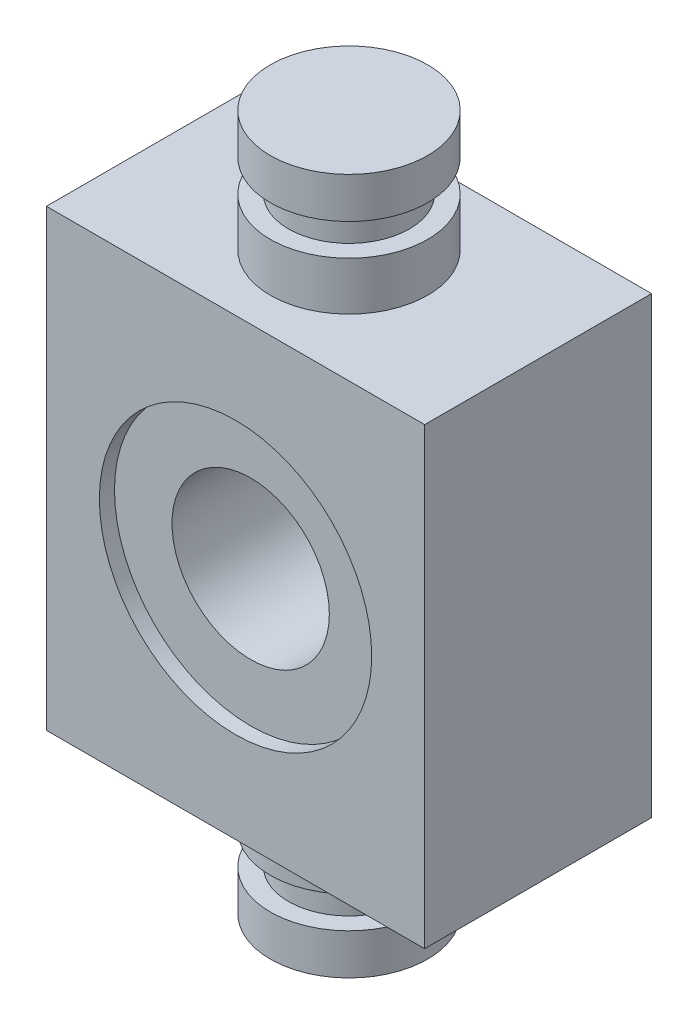
ISO-10303-21;
HEADER;
FILE_DESCRIPTION(('STEP AP214'),'2;1');
FILE_NAME('part.step','',(''),(''),'','','');
FILE_SCHEMA(('AUTOMOTIVE_DESIGN { 1 0 10303 214 1 1 1 1 }'));
ENDSEC;
DATA;
#1=APPLICATION_CONTEXT('core data for automotive mechanical design processes');
#2=APPLICATION_PROTOCOL_DEFINITION('international standard','automotive_design',2000,#1);
#3=PRODUCT_CONTEXT('',#1,'mechanical');
#4=PRODUCT('Part','Part','',(#3));
#5=PRODUCT_RELATED_PRODUCT_CATEGORY('part','',(#4));
#6=PRODUCT_DEFINITION_FORMATION('','',#4);
#7=PRODUCT_DEFINITION_CONTEXT('part definition',#1,'design');
#8=PRODUCT_DEFINITION('design','',#6,#7);
#9=PRODUCT_DEFINITION_SHAPE('','',#8);
#10=(LENGTH_UNIT() NAMED_UNIT(*) SI_UNIT(.MILLI.,.METRE.));
#11=(NAMED_UNIT(*) PLANE_ANGLE_UNIT() SI_UNIT($,.RADIAN.));
#12=(NAMED_UNIT(*) SI_UNIT($,.STERADIAN.) SOLID_ANGLE_UNIT());
#13=UNCERTAINTY_MEASURE_WITH_UNIT(LENGTH_MEASURE(1.E-05),#10,'distance_accuracy_value','');
#14=(GEOMETRIC_REPRESENTATION_CONTEXT(3) GLOBAL_UNCERTAINTY_ASSIGNED_CONTEXT((#13)) GLOBAL_UNIT_ASSIGNED_CONTEXT((#10,
#11,#12)) REPRESENTATION_CONTEXT('',''));
#15=CARTESIAN_POINT('',(0.,0.,0.));
#16=DIRECTION('',(0.,0.,1.));
#17=DIRECTION('',(1.,0.,0.));
#18=AXIS2_PLACEMENT_3D('',#15,#16,#17);
#19=CARTESIAN_POINT('',(-62.5,-75.,37.5));
#20=DIRECTION('',(0.,1.,0.));
#21=DIRECTION('',(-1.,0.,0.));
#22=AXIS2_PLACEMENT_3D('',#19,#20,#21);
#23=PLANE('',#22);
#24=CARTESIAN_POINT('',(0.,-75.,0.));
#25=DIRECTION('',(0.,1.,0.));
#26=DIRECTION('',(-1.,0.,0.));
#27=AXIS2_PLACEMENT_3D('',#24,#25,#26);
#28=CIRCLE('',#27,26.);
#29=CARTESIAN_POINT('',(-26.,-75.,0.));
#30=VERTEX_POINT('',#29);
#31=EDGE_CURVE('E163',#30,#30,#28,.T.);
#32=ORIENTED_EDGE('',*,*,#31,.T.);
#33=EDGE_LOOP('',(#32));
#34=FACE_BOUND('',#33,.T.);
#35=DIRECTION('',(1.,0.,0.));
#36=VECTOR('',#35,1.);
#37=CARTESIAN_POINT('',(-62.5,-75.,-37.5));
#38=LINE('',#37,#36);
#39=CARTESIAN_POINT('',(-62.5,-75.,-37.5));
#40=VERTEX_POINT('',#39);
#41=CARTESIAN_POINT('',(62.5,-75.,-37.5));
#42=VERTEX_POINT('',#41);
#43=EDGE_CURVE('E108',#40,#42,#38,.T.);
#44=ORIENTED_EDGE('',*,*,#43,.T.);
#45=DIRECTION('',(0.,0.,-1.));
#46=VECTOR('',#45,1.);
#47=CARTESIAN_POINT('',(62.5,-75.,37.5));
#48=LINE('',#47,#46);
#49=CARTESIAN_POINT('',(62.5,-75.,37.5));
#50=VERTEX_POINT('',#49);
#51=EDGE_CURVE('E99',#50,#42,#48,.T.);
#52=ORIENTED_EDGE('',*,*,#51,.F.);
#53=DIRECTION('',(1.,0.,0.));
#54=VECTOR('',#53,1.);
#55=CARTESIAN_POINT('',(-62.5,-75.,37.5));
#56=LINE('',#55,#54);
#57=CARTESIAN_POINT('',(-62.5,-75.,37.5));
#58=VERTEX_POINT('',#57);
#59=EDGE_CURVE('E93',#58,#50,#56,.T.);
#60=ORIENTED_EDGE('',*,*,#59,.F.);
#61=DIRECTION('',(0.,0.,-1.));
#62=VECTOR('',#61,1.);
#63=CARTESIAN_POINT('',(-62.5,-75.,37.5));
#64=LINE('',#63,#62);
#65=EDGE_CURVE('E104',#58,#40,#64,.T.);
#66=ORIENTED_EDGE('',*,*,#65,.T.);
#67=EDGE_LOOP('',(#44,#52,#60,#66));
#68=FACE_BOUND('',#67,.T.);
#69=ADVANCED_FACE('F39',(#34,#68),#23,.F.);
#70=CARTESIAN_POINT('',(62.5,-75.,37.5));
#71=DIRECTION('',(-1.,0.,0.));
#72=DIRECTION('',(0.,-1.,0.));
#73=AXIS2_PLACEMENT_3D('',#70,#71,#72);
#74=PLANE('',#73);
#75=DIRECTION('',(0.,1.,0.));
#76=VECTOR('',#75,1.);
#77=CARTESIAN_POINT('',(62.5,-75.,-37.5));
#78=LINE('',#77,#76);
#79=CARTESIAN_POINT('',(62.5,75.,-37.5));
#80=VERTEX_POINT('',#79);
#81=EDGE_CURVE('E98',#42,#80,#78,.T.);
#82=ORIENTED_EDGE('',*,*,#81,.T.);
#83=DIRECTION('',(0.,0.,-1.));
#84=VECTOR('',#83,1.);
#85=CARTESIAN_POINT('',(62.5,75.,37.5));
#86=LINE('',#85,#84);
#87=CARTESIAN_POINT('',(62.5,75.,37.5));
#88=VERTEX_POINT('',#87);
#89=EDGE_CURVE('E96',#88,#80,#86,.T.);
#90=ORIENTED_EDGE('',*,*,#89,.F.);
#91=DIRECTION('',(0.,1.,0.));
#92=VECTOR('',#91,1.);
#93=CARTESIAN_POINT('',(62.5,-75.,37.5));
#94=LINE('',#93,#92);
#95=EDGE_CURVE('E88',#50,#88,#94,.T.);
#96=ORIENTED_EDGE('',*,*,#95,.F.);
#97=ORIENTED_EDGE('',*,*,#51,.T.);
#98=EDGE_LOOP('',(#82,#90,#96,#97));
#99=FACE_BOUND('',#98,.T.);
#100=ADVANCED_FACE('F97',(#99),#74,.F.);
#101=CARTESIAN_POINT('',(-62.5,75.,37.5));
#102=DIRECTION('',(0.,-1.,0.));
#103=DIRECTION('',(1.,0.,0.));
#104=AXIS2_PLACEMENT_3D('',#101,#102,#103);
#105=PLANE('',#104);
#106=CARTESIAN_POINT('',(0.,75.,0.));
#107=DIRECTION('',(0.,1.,0.));
#108=DIRECTION('',(-1.,0.,0.));
#109=AXIS2_PLACEMENT_3D('',#106,#107,#108);
#110=CIRCLE('',#109,26.);
#111=CARTESIAN_POINT('',(-26.,75.,0.));
#112=VERTEX_POINT('',#111);
#113=EDGE_CURVE('E48',#112,#112,#110,.T.);
#114=ORIENTED_EDGE('',*,*,#113,.F.);
#115=EDGE_LOOP('',(#114));
#116=FACE_BOUND('',#115,.T.);
#117=DIRECTION('',(-1.,0.,0.));
#118=VECTOR('',#117,1.);
#119=CARTESIAN_POINT('',(-62.5,75.,-37.5));
#120=LINE('',#119,#118);
#121=CARTESIAN_POINT('',(-62.5,75.,-37.5));
#122=VERTEX_POINT('',#121);
#123=EDGE_CURVE('E74',#80,#122,#120,.T.);
#124=ORIENTED_EDGE('',*,*,#123,.T.);
#125=DIRECTION('',(0.,0.,-1.));
#126=VECTOR('',#125,1.);
#127=CARTESIAN_POINT('',(-62.5,75.,37.5));
#128=LINE('',#127,#126);
#129=CARTESIAN_POINT('',(-62.5,75.,37.5));
#130=VERTEX_POINT('',#129);
#131=EDGE_CURVE('E100',#130,#122,#128,.T.);
#132=ORIENTED_EDGE('',*,*,#131,.F.);
#133=DIRECTION('',(-1.,0.,0.));
#134=VECTOR('',#133,1.);
#135=CARTESIAN_POINT('',(-62.5,75.,37.5));
#136=LINE('',#135,#134);
#137=EDGE_CURVE('E91',#88,#130,#136,.T.);
#138=ORIENTED_EDGE('',*,*,#137,.F.);
#139=ORIENTED_EDGE('',*,*,#89,.T.);
#140=EDGE_LOOP('',(#124,#132,#138,#139));
#141=FACE_BOUND('',#140,.T.);
#142=ADVANCED_FACE('F102',(#116,#141),#105,.F.);
#143=CARTESIAN_POINT('',(-62.5,-75.,37.5));
#144=DIRECTION('',(1.,0.,0.));
#145=DIRECTION('',(0.,1.,0.));
#146=AXIS2_PLACEMENT_3D('',#143,#144,#145);
#147=PLANE('',#146);
#148=DIRECTION('',(0.,-1.,0.));
#149=VECTOR('',#148,1.);
#150=CARTESIAN_POINT('',(-62.5,-75.,-37.5));
#151=LINE('',#150,#149);
#152=EDGE_CURVE('E80',#122,#40,#151,.T.);
#153=ORIENTED_EDGE('',*,*,#152,.T.);
#154=ORIENTED_EDGE('',*,*,#65,.F.);
#155=DIRECTION('',(0.,-1.,0.));
#156=VECTOR('',#155,1.);
#157=CARTESIAN_POINT('',(-62.5,-75.,37.5));
#158=LINE('',#157,#156);
#159=EDGE_CURVE('E57',#130,#58,#158,.T.);
#160=ORIENTED_EDGE('',*,*,#159,.F.);
#161=ORIENTED_EDGE('',*,*,#131,.T.);
#162=EDGE_LOOP('',(#153,#154,#160,#161));
#163=FACE_BOUND('',#162,.T.);
#164=ADVANCED_FACE('F166',(#163),#147,.F.);
#165=CARTESIAN_POINT('',(0.,0.,37.5));
#166=DIRECTION('',(0.,0.,1.));
#167=DIRECTION('',(1.,0.,0.));
#168=AXIS2_PLACEMENT_3D('',#165,#166,#167);
#169=PLANE('',#168);
#170=CARTESIAN_POINT('',(0.,0.,37.5));
#171=DIRECTION('',(0.,0.,1.));
#172=DIRECTION('',(1.,0.,0.));
#173=AXIS2_PLACEMENT_3D('',#170,#171,#172);
#174=CIRCLE('',#173,45.);
#175=CARTESIAN_POINT('',(-45.,0.,37.5));
#176=VERTEX_POINT('',#175);
#177=EDGE_CURVE('E42',#176,#176,#174,.F.);
#178=ORIENTED_EDGE('',*,*,#177,.T.);
#179=EDGE_LOOP('',(#178));
#180=FACE_BOUND('',#179,.T.);
#181=ORIENTED_EDGE('',*,*,#59,.T.);
#182=ORIENTED_EDGE('',*,*,#95,.T.);
#183=ORIENTED_EDGE('',*,*,#137,.T.);
#184=ORIENTED_EDGE('',*,*,#159,.T.);
#185=EDGE_LOOP('',(#181,#182,#183,#184));
#186=FACE_BOUND('',#185,.T.);
#187=ADVANCED_FACE('F89',(#180,#186),#169,.T.);
#188=CARTESIAN_POINT('',(0.,0.,-37.5));
#189=DIRECTION('',(0.,0.,1.));
#190=DIRECTION('',(1.,0.,0.));
#191=AXIS2_PLACEMENT_3D('',#188,#189,#190);
#192=PLANE('',#191);
#193=CARTESIAN_POINT('',(0.,0.,-37.5));
#194=DIRECTION('',(0.,0.,1.));
#195=DIRECTION('',(1.,0.,0.));
#196=AXIS2_PLACEMENT_3D('',#193,#194,#195);
#197=CIRCLE('',#196,26.);
#198=CARTESIAN_POINT('',(26.,0.,-37.5));
#199=VERTEX_POINT('',#198);
#200=EDGE_CURVE('E125',#199,#199,#197,.F.);
#201=ORIENTED_EDGE('',*,*,#200,.F.);
#202=EDGE_LOOP('',(#201));
#203=FACE_BOUND('',#202,.T.);
#204=ORIENTED_EDGE('',*,*,#43,.F.);
#205=ORIENTED_EDGE('',*,*,#152,.F.);
#206=ORIENTED_EDGE('',*,*,#123,.F.);
#207=ORIENTED_EDGE('',*,*,#81,.F.);
#208=EDGE_LOOP('',(#204,#205,#206,#207));
#209=FACE_BOUND('',#208,.T.);
#210=ADVANCED_FACE('F140',(#203,#209),#192,.F.);
#211=CARTESIAN_POINT('',(0.,0.,37.500012));
#212=DIRECTION('',(0.,0.,-1.));
#213=DIRECTION('',(-1.,0.,0.));
#214=AXIS2_PLACEMENT_3D('',#211,#212,#213);
#215=CYLINDRICAL_SURFACE('',#214,45.);
#216=CARTESIAN_POINT('',(0.,0.,32.5));
#217=DIRECTION('',(0.,0.,1.));
#218=DIRECTION('',(1.,0.,0.));
#219=AXIS2_PLACEMENT_3D('',#216,#217,#218);
#220=CIRCLE('',#219,45.);
#221=CARTESIAN_POINT('',(-45.,0.,32.5));
#222=VERTEX_POINT('',#221);
#223=EDGE_CURVE('E128',#222,#222,#220,.T.);
#224=CARTESIAN_POINT('',(-45.,0.,37.5));
#225=CARTESIAN_POINT('',(-45.,0.,37.4479166666667));
#226=CARTESIAN_POINT('',(-45.,0.,37.3958333333333));
#227=CARTESIAN_POINT('',(-45.,0.,37.2916666666667));
#228=CARTESIAN_POINT('',(-45.,0.,37.2395833333333));
#229=CARTESIAN_POINT('',(-45.,0.,37.1354166666667));
#230=CARTESIAN_POINT('',(-45.,0.,37.0833333333333));
#231=CARTESIAN_POINT('',(-45.,0.,36.9791666666667));
#232=CARTESIAN_POINT('',(-45.,0.,36.9270833333333));
#233=CARTESIAN_POINT('',(-45.,0.,36.8229166666667));
#234=CARTESIAN_POINT('',(-45.,0.,36.7708333333333));
#235=CARTESIAN_POINT('',(-45.,0.,36.6666666666667));
#236=CARTESIAN_POINT('',(-45.,0.,36.6145833333333));
#237=CARTESIAN_POINT('',(-45.,0.,36.5104166666667));
#238=CARTESIAN_POINT('',(-45.,0.,36.4583333333333));
#239=CARTESIAN_POINT('',(-45.,0.,36.3541666666667));
#240=CARTESIAN_POINT('',(-45.,0.,36.3020833333333));
#241=CARTESIAN_POINT('',(-45.,0.,36.1979166666667));
#242=CARTESIAN_POINT('',(-45.,0.,36.1458333333333));
#243=CARTESIAN_POINT('',(-45.,0.,36.0416666666667));
#244=CARTESIAN_POINT('',(-45.,0.,35.9895833333333));
#245=CARTESIAN_POINT('',(-45.,0.,35.8854166666667));
#246=CARTESIAN_POINT('',(-45.,0.,35.8333333333333));
#247=CARTESIAN_POINT('',(-45.,0.,35.7291666666667));
#248=CARTESIAN_POINT('',(-45.,0.,35.6770833333333));
#249=CARTESIAN_POINT('',(-45.,0.,35.5729166666667));
#250=CARTESIAN_POINT('',(-45.,0.,35.5208333333333));
#251=CARTESIAN_POINT('',(-45.,0.,35.4166666666667));
#252=CARTESIAN_POINT('',(-45.,0.,35.3645833333333));
#253=CARTESIAN_POINT('',(-45.,0.,35.2604166666667));
#254=CARTESIAN_POINT('',(-45.,0.,35.2083333333333));
#255=CARTESIAN_POINT('',(-45.,0.,35.1041666666667));
#256=CARTESIAN_POINT('',(-45.,0.,35.0520833333333));
#257=CARTESIAN_POINT('',(-45.,0.,34.9479166666667));
#258=CARTESIAN_POINT('',(-45.,0.,34.8958333333333));
#259=CARTESIAN_POINT('',(-45.,0.,34.7916666666667));
#260=CARTESIAN_POINT('',(-45.,0.,34.7395833333333));
#261=CARTESIAN_POINT('',(-45.,0.,34.6354166666667));
#262=CARTESIAN_POINT('',(-45.,0.,34.5833333333333));
#263=CARTESIAN_POINT('',(-45.,0.,34.4791666666667));
#264=CARTESIAN_POINT('',(-45.,0.,34.4270833333333));
#265=CARTESIAN_POINT('',(-45.,0.,34.3229166666667));
#266=CARTESIAN_POINT('',(-45.,0.,34.2708333333333));
#267=CARTESIAN_POINT('',(-45.,0.,34.1666666666667));
#268=CARTESIAN_POINT('',(-45.,0.,34.1145833333333));
#269=CARTESIAN_POINT('',(-45.,0.,34.0104166666667));
#270=CARTESIAN_POINT('',(-45.,0.,33.9583333333333));
#271=CARTESIAN_POINT('',(-45.,0.,33.8541666666667));
#272=CARTESIAN_POINT('',(-45.,0.,33.8020833333333));
#273=CARTESIAN_POINT('',(-45.,0.,33.6979166666667));
#274=CARTESIAN_POINT('',(-45.,0.,33.6458333333333));
#275=CARTESIAN_POINT('',(-45.,0.,33.5416666666667));
#276=CARTESIAN_POINT('',(-45.,0.,33.4895833333333));
#277=CARTESIAN_POINT('',(-45.,0.,33.3854166666667));
#278=CARTESIAN_POINT('',(-45.,0.,33.3333333333333));
#279=CARTESIAN_POINT('',(-45.,0.,33.2291666666667));
#280=CARTESIAN_POINT('',(-45.,0.,33.1770833333333));
#281=CARTESIAN_POINT('',(-45.,0.,33.0729166666667));
#282=CARTESIAN_POINT('',(-45.,0.,33.0208333333333));
#283=CARTESIAN_POINT('',(-45.,0.,32.9166666666667));
#284=CARTESIAN_POINT('',(-45.,0.,32.8645833333333));
#285=CARTESIAN_POINT('',(-45.,0.,32.7604166666667));
#286=CARTESIAN_POINT('',(-45.,0.,32.7083333333333));
#287=CARTESIAN_POINT('',(-45.,0.,32.6041666666667));
#288=CARTESIAN_POINT('',(-45.,0.,32.5520833333333));
#289=CARTESIAN_POINT('',(-45.,0.,32.5));
#290=B_SPLINE_CURVE_WITH_KNOTS('',3,(#224,#225,#226,#227,#228,#229,#230,#231,#232,#233,#234,
#235,#236,#237,#238,#239,#240,#241,#242,#243,#244,#245,#246,#247,#248,#249,#250,#251,#252,#253,
#254,#255,#256,#257,#258,#259,#260,#261,#262,#263,#264,#265,#266,#267,#268,#269,#270,#271,#272,
#273,#274,#275,#276,#277,#278,#279,#280,#281,#282,#283,#284,#285,#286,#287,#288,#289),
.UNSPECIFIED.,.F.,.F.,(4,2,2,2,2,2,2,2,2,2,2,2,2,2,2,2,2,2,2,2,2,2,2,2,2,2,2,2,2,2,2,2,4),(0.,
0.156250000000004,0.3125,0.468750000000004,0.625000000000001,0.781250000000004,
0.937500000000001,1.09375,1.25,1.40625,1.5625,1.71875,1.875,2.03125000000001,2.1875,
2.34375000000001,2.5,2.65625000000001,2.8125,2.96875,3.125,3.28125,3.4375,3.59375,3.75,3.90625,
4.0625,4.21875,4.375,4.53125,4.6875,4.84375,5.),.UNSPECIFIED.);
#291=EDGE_CURVE('BSEAM136',#176,#222,#290,.T.);
#292=ORIENTED_EDGE('',*,*,#177,.F.);
#293=ORIENTED_EDGE('',*,*,#223,.F.);
#294=ORIENTED_EDGE('',*,*,#291,.T.);
#295=ORIENTED_EDGE('',*,*,#291,.F.);
#296=EDGE_LOOP('',(#292,#294,#293,#295));
#297=FACE_BOUND('',#296,.T.);
#298=ADVANCED_FACE('F136',(#297),#215,.F.);
#299=CARTESIAN_POINT('',(0.,0.,32.5));
#300=DIRECTION('',(0.,0.,1.));
#301=DIRECTION('',(1.,0.,0.));
#302=AXIS2_PLACEMENT_3D('',#299,#300,#301);
#303=PLANE('',#302);
#304=CARTESIAN_POINT('',(0.,0.,32.5));
#305=DIRECTION('',(0.,0.,1.));
#306=DIRECTION('',(1.,0.,0.));
#307=AXIS2_PLACEMENT_3D('',#304,#305,#306);
#308=CIRCLE('',#307,26.);
#309=CARTESIAN_POINT('',(26.,0.,32.5));
#310=VERTEX_POINT('',#309);
#311=EDGE_CURVE('E122',#310,#310,#308,.T.);
#312=ORIENTED_EDGE('',*,*,#311,.F.);
#313=EDGE_LOOP('',(#312));
#314=FACE_BOUND('',#313,.T.);
#315=ORIENTED_EDGE('',*,*,#223,.T.);
#316=EDGE_LOOP('',(#315));
#317=FACE_BOUND('',#316,.T.);
#318=ADVANCED_FACE('F139',(#314,#317),#303,.T.);
#319=CARTESIAN_POINT('',(0.,0.,-37.501));
#320=DIRECTION('',(0.,0.,1.));
#321=DIRECTION('',(1.,0.,0.));
#322=AXIS2_PLACEMENT_3D('',#319,#320,#321);
#323=CYLINDRICAL_SURFACE('',#322,26.);
#324=ORIENTED_EDGE('',*,*,#311,.T.);
#325=EDGE_LOOP('',(#324));
#326=FACE_BOUND('',#325,.T.);
#327=ORIENTED_EDGE('',*,*,#200,.T.);
#328=EDGE_LOOP('',(#327));
#329=FACE_BOUND('',#328,.T.);
#330=ADVANCED_FACE('F147',(#326,#329),#323,.F.);
#331=CARTESIAN_POINT('',(0.,91.,0.));
#332=DIRECTION('',(0.,-1.,0.));
#333=DIRECTION('',(1.,0.,0.));
#334=AXIS2_PLACEMENT_3D('',#331,#332,#333);
#335=CYLINDRICAL_SURFACE('',#334,26.);
#336=CARTESIAN_POINT('',(0.,91.,0.));
#337=DIRECTION('',(0.,1.,0.));
#338=DIRECTION('',(-1.,0.,0.));
#339=AXIS2_PLACEMENT_3D('',#336,#337,#338);
#340=CIRCLE('',#339,26.);
#341=CARTESIAN_POINT('',(-26.,91.,0.));
#342=VERTEX_POINT('',#341);
#343=EDGE_CURVE('E121',#342,#342,#340,.T.);
#344=ORIENTED_EDGE('',*,*,#343,.F.);
#345=EDGE_LOOP('',(#344));
#346=FACE_BOUND('',#345,.T.);
#347=ORIENTED_EDGE('',*,*,#113,.T.);
#348=EDGE_LOOP('',(#347));
#349=FACE_BOUND('',#348,.T.);
#350=ADVANCED_FACE('F184',(#346,#349),#335,.T.);
#351=CARTESIAN_POINT('',(0.,91.,0.));
#352=DIRECTION('',(0.,1.,0.));
#353=DIRECTION('',(-1.,0.,0.));
#354=AXIS2_PLACEMENT_3D('',#351,#352,#353);
#355=PLANE('',#354);
#356=CARTESIAN_POINT('',(0.,91.,0.));
#357=DIRECTION('',(0.,1.,0.));
#358=DIRECTION('',(-1.,0.,0.));
#359=AXIS2_PLACEMENT_3D('',#356,#357,#358);
#360=CIRCLE('',#359,20.);
#361=CARTESIAN_POINT('',(20.,91.,0.));
#362=VERTEX_POINT('',#361);
#363=EDGE_CURVE('E11',#362,#362,#360,.T.);
#364=ORIENTED_EDGE('',*,*,#363,.F.);
#365=EDGE_LOOP('',(#364));
#366=FACE_BOUND('',#365,.T.);
#367=ORIENTED_EDGE('',*,*,#343,.T.);
#368=EDGE_LOOP('',(#367));
#369=FACE_BOUND('',#368,.T.);
#370=ADVANCED_FACE('F188',(#366,#369),#355,.T.);
#371=CARTESIAN_POINT('',(0.,101.5,0.));
#372=DIRECTION('',(0.,-1.,0.));
#373=DIRECTION('',(1.,0.,0.));
#374=AXIS2_PLACEMENT_3D('',#371,#372,#373);
#375=CYLINDRICAL_SURFACE('',#374,20.);
#376=CARTESIAN_POINT('',(0.,101.5,0.));
#377=DIRECTION('',(0.,1.,0.));
#378=DIRECTION('',(-1.,0.,0.));
#379=AXIS2_PLACEMENT_3D('',#376,#377,#378);
#380=CIRCLE('',#379,20.);
#381=CARTESIAN_POINT('',(20.,101.5,0.));
#382=VERTEX_POINT('',#381);
#383=EDGE_CURVE('E326',#382,#382,#380,.T.);
#384=CARTESIAN_POINT('',(20.,101.5,0.));
#385=CARTESIAN_POINT('',(20.,101.390625,0.));
#386=CARTESIAN_POINT('',(20.,101.28125,0.));
#387=CARTESIAN_POINT('',(20.,101.0625,0.));
#388=CARTESIAN_POINT('',(20.,100.953125,0.));
#389=CARTESIAN_POINT('',(20.,100.734375,0.));
#390=CARTESIAN_POINT('',(20.,100.625,0.));
#391=CARTESIAN_POINT('',(20.,100.40625,0.));
#392=CARTESIAN_POINT('',(20.,100.296875,0.));
#393=CARTESIAN_POINT('',(20.,100.078125,0.));
#394=CARTESIAN_POINT('',(20.,99.96875,0.));
#395=CARTESIAN_POINT('',(20.,99.75,0.));
#396=CARTESIAN_POINT('',(20.,99.640625,0.));
#397=CARTESIAN_POINT('',(20.,99.421875,0.));
#398=CARTESIAN_POINT('',(20.,99.3125,0.));
#399=CARTESIAN_POINT('',(20.,99.09375,0.));
#400=CARTESIAN_POINT('',(20.,98.984375,0.));
#401=CARTESIAN_POINT('',(20.,98.765625,0.));
#402=CARTESIAN_POINT('',(20.,98.65625,0.));
#403=CARTESIAN_POINT('',(20.,98.4375,0.));
#404=CARTESIAN_POINT('',(20.,98.328125,0.));
#405=CARTESIAN_POINT('',(20.,98.109375,0.));
#406=CARTESIAN_POINT('',(20.,98.,0.));
#407=CARTESIAN_POINT('',(20.,97.78125,0.));
#408=CARTESIAN_POINT('',(20.,97.671875,0.));
#409=CARTESIAN_POINT('',(20.,97.453125,0.));
#410=CARTESIAN_POINT('',(20.,97.34375,0.));
#411=CARTESIAN_POINT('',(20.,97.125,0.));
#412=CARTESIAN_POINT('',(20.,97.015625,0.));
#413=CARTESIAN_POINT('',(20.,96.796875,0.));
#414=CARTESIAN_POINT('',(20.,96.6875,0.));
#415=CARTESIAN_POINT('',(20.,96.46875,0.));
#416=CARTESIAN_POINT('',(20.,96.359375,0.));
#417=CARTESIAN_POINT('',(20.,96.140625,0.));
#418=CARTESIAN_POINT('',(20.,96.03125,0.));
#419=CARTESIAN_POINT('',(20.,95.8125,0.));
#420=CARTESIAN_POINT('',(20.,95.703125,0.));
#421=CARTESIAN_POINT('',(20.,95.484375,0.));
#422=CARTESIAN_POINT('',(20.,95.375,0.));
#423=CARTESIAN_POINT('',(20.,95.15625,0.));
#424=CARTESIAN_POINT('',(20.,95.046875,0.));
#425=CARTESIAN_POINT('',(20.,94.828125,0.));
#426=CARTESIAN_POINT('',(20.,94.71875,0.));
#427=CARTESIAN_POINT('',(20.,94.5,0.));
#428=CARTESIAN_POINT('',(20.,94.390625,0.));
#429=CARTESIAN_POINT('',(20.,94.171875,0.));
#430=CARTESIAN_POINT('',(20.,94.0625,0.));
#431=CARTESIAN_POINT('',(20.,93.84375,0.));
#432=CARTESIAN_POINT('',(20.,93.734375,0.));
#433=CARTESIAN_POINT('',(20.,93.515625,0.));
#434=CARTESIAN_POINT('',(20.,93.40625,0.));
#435=CARTESIAN_POINT('',(20.,93.1875,0.));
#436=CARTESIAN_POINT('',(20.,93.078125,0.));
#437=CARTESIAN_POINT('',(20.,92.859375,0.));
#438=CARTESIAN_POINT('',(20.,92.75,0.));
#439=CARTESIAN_POINT('',(20.,92.53125,0.));
#440=CARTESIAN_POINT('',(20.,92.421875,0.));
#441=CARTESIAN_POINT('',(20.,92.203125,0.));
#442=CARTESIAN_POINT('',(20.,92.09375,0.));
#443=CARTESIAN_POINT('',(20.,91.875,0.));
#444=CARTESIAN_POINT('',(20.,91.765625,0.));
#445=CARTESIAN_POINT('',(20.,91.546875,0.));
#446=CARTESIAN_POINT('',(20.,91.4375,0.));
#447=CARTESIAN_POINT('',(20.,91.21875,0.));
#448=CARTESIAN_POINT('',(20.,91.109375,0.));
#449=CARTESIAN_POINT('',(20.,91.,0.));
#450=B_SPLINE_CURVE_WITH_KNOTS('',3,(#384,#385,#386,#387,#388,#389,#390,#391,#392,#393,#394,
#395,#396,#397,#398,#399,#400,#401,#402,#403,#404,#405,#406,#407,#408,#409,#410,#411,#412,#413,
#414,#415,#416,#417,#418,#419,#420,#421,#422,#423,#424,#425,#426,#427,#428,#429,#430,#431,#432,
#433,#434,#435,#436,#437,#438,#439,#440,#441,#442,#443,#444,#445,#446,#447,#448,#449),
.UNSPECIFIED.,.F.,.F.,(4,2,2,2,2,2,2,2,2,2,2,2,2,2,2,2,2,2,2,2,2,2,2,2,2,2,2,2,2,2,2,2,4),(0.,
0.328124999999999,0.656249999999997,0.984374999999996,1.31249999999999,1.64062499999999,
1.96874999999999,2.29687499999999,2.62499999999999,2.95312499999999,3.28124999999999,
3.60937499999998,3.9375,4.26562499999999,4.59374999999999,4.92187499999999,5.24999999999999,
5.57812499999999,5.90624999999999,6.23437499999999,6.56249999999998,6.89062499999998,
7.21874999999998,7.54687499999999,7.87499999999999,8.20312499999999,8.53124999999999,
8.85937499999999,9.18749999999999,9.51562499999999,9.84374999999998,10.171875,10.5),.UNSPECIFIED.);
#451=EDGE_CURVE('BSEAM197',#382,#362,#450,.T.);
#452=ORIENTED_EDGE('',*,*,#383,.F.);
#453=ORIENTED_EDGE('',*,*,#363,.T.);
#454=ORIENTED_EDGE('',*,*,#451,.T.);
#455=ORIENTED_EDGE('',*,*,#451,.F.);
#456=EDGE_LOOP('',(#452,#454,#453,#455));
#457=FACE_BOUND('',#456,.T.);
#458=ADVANCED_FACE('F197',(#457),#375,.T.);
#459=CARTESIAN_POINT('',(0.,115.,0.));
#460=DIRECTION('',(0.,-1.,0.));
#461=DIRECTION('',(1.,0.,0.));
#462=AXIS2_PLACEMENT_3D('',#459,#460,#461);
#463=CYLINDRICAL_SURFACE('',#462,26.);
#464=CARTESIAN_POINT('',(0.,115.,0.));
#465=DIRECTION('',(0.,1.,0.));
#466=DIRECTION('',(-1.,0.,0.));
#467=AXIS2_PLACEMENT_3D('',#464,#465,#466);
#468=CIRCLE('',#467,26.);
#469=CARTESIAN_POINT('',(-26.,115.,0.));
#470=VERTEX_POINT('',#469);
#471=EDGE_CURVE('E323',#470,#470,#468,.T.);
#472=ORIENTED_EDGE('',*,*,#471,.F.);
#473=EDGE_LOOP('',(#472));
#474=FACE_BOUND('',#473,.T.);
#475=CARTESIAN_POINT('',(0.,101.5,0.));
#476=DIRECTION('',(0.,1.,0.));
#477=DIRECTION('',(-1.,0.,0.));
#478=AXIS2_PLACEMENT_3D('',#475,#476,#477);
#479=CIRCLE('',#478,26.);
#480=CARTESIAN_POINT('',(-26.,101.5,0.));
#481=VERTEX_POINT('',#480);
#482=EDGE_CURVE('E321',#481,#481,#479,.T.);
#483=ORIENTED_EDGE('',*,*,#482,.T.);
#484=EDGE_LOOP('',(#483));
#485=FACE_BOUND('',#484,.T.);
#486=ADVANCED_FACE('F206',(#474,#485),#463,.T.);
#487=CARTESIAN_POINT('',(0.,115.,0.));
#488=DIRECTION('',(0.,1.,0.));
#489=DIRECTION('',(-1.,0.,0.));
#490=AXIS2_PLACEMENT_3D('',#487,#488,#489);
#491=PLANE('',#490);
#492=ORIENTED_EDGE('',*,*,#471,.T.);
#493=EDGE_LOOP('',(#492));
#494=FACE_BOUND('',#493,.T.);
#495=ADVANCED_FACE('F215',(#494),#491,.T.);
#496=CARTESIAN_POINT('',(0.,101.5,0.));
#497=DIRECTION('',(0.,1.,0.));
#498=DIRECTION('',(-1.,0.,0.));
#499=AXIS2_PLACEMENT_3D('',#496,#497,#498);
#500=PLANE('',#499);
#501=ORIENTED_EDGE('',*,*,#383,.T.);
#502=EDGE_LOOP('',(#501));
#503=FACE_BOUND('',#502,.T.);
#504=ORIENTED_EDGE('',*,*,#482,.F.);
#505=EDGE_LOOP('',(#504));
#506=FACE_BOUND('',#505,.T.);
#507=ADVANCED_FACE('F223',(#503,#506),#500,.F.);
#508=CARTESIAN_POINT('',(0.,-91.,0.));
#509=DIRECTION('',(0.,1.,0.));
#510=DIRECTION('',(-1.,0.,0.));
#511=AXIS2_PLACEMENT_3D('',#508,#509,#510);
#512=CYLINDRICAL_SURFACE('',#511,26.);
#513=CARTESIAN_POINT('',(0.,-91.,0.));
#514=DIRECTION('',(0.,1.,0.));
#515=DIRECTION('',(-1.,0.,0.));
#516=AXIS2_PLACEMENT_3D('',#513,#514,#515);
#517=CIRCLE('',#516,26.);
#518=CARTESIAN_POINT('',(-26.,-91.,0.));
#519=VERTEX_POINT('',#518);
#520=EDGE_CURVE('E318',#519,#519,#517,.T.);
#521=ORIENTED_EDGE('',*,*,#520,.T.);
#522=EDGE_LOOP('',(#521));
#523=FACE_BOUND('',#522,.T.);
#524=ORIENTED_EDGE('',*,*,#31,.F.);
#525=EDGE_LOOP('',(#524));
#526=FACE_BOUND('',#525,.T.);
#527=ADVANCED_FACE('F231',(#523,#526),#512,.T.);
#528=CARTESIAN_POINT('',(0.,-91.,0.));
#529=DIRECTION('',(0.,-1.,0.));
#530=DIRECTION('',(-1.,0.,0.));
#531=AXIS2_PLACEMENT_3D('',#528,#529,#530);
#532=PLANE('',#531);
#533=CARTESIAN_POINT('',(0.,-91.,0.));
#534=DIRECTION('',(0.,1.,0.));
#535=DIRECTION('',(-1.,0.,0.));
#536=AXIS2_PLACEMENT_3D('',#533,#534,#535);
#537=CIRCLE('',#536,20.);
#538=CARTESIAN_POINT('',(-20.,-91.,0.));
#539=VERTEX_POINT('',#538);
#540=EDGE_CURVE('E315',#539,#539,#537,.T.);
#541=ORIENTED_EDGE('',*,*,#540,.T.);
#542=EDGE_LOOP('',(#541));
#543=FACE_BOUND('',#542,.T.);
#544=ORIENTED_EDGE('',*,*,#520,.F.);
#545=EDGE_LOOP('',(#544));
#546=FACE_BOUND('',#545,.T.);
#547=ADVANCED_FACE('F243',(#543,#546),#532,.T.);
#548=CARTESIAN_POINT('',(0.,-101.5,0.));
#549=DIRECTION('',(0.,1.,0.));
#550=DIRECTION('',(-1.,0.,0.));
#551=AXIS2_PLACEMENT_3D('',#548,#549,#550);
#552=CYLINDRICAL_SURFACE('',#551,20.);
#553=CARTESIAN_POINT('',(0.,-101.5,0.));
#554=DIRECTION('',(0.,1.,0.));
#555=DIRECTION('',(-1.,0.,0.));
#556=AXIS2_PLACEMENT_3D('',#553,#554,#555);
#557=CIRCLE('',#556,20.);
#558=CARTESIAN_POINT('',(-20.,-101.5,0.));
#559=VERTEX_POINT('',#558);
#560=EDGE_CURVE('E304',#559,#559,#557,.T.);
#561=CARTESIAN_POINT('',(-20.,-101.5,0.));
#562=CARTESIAN_POINT('',(-20.,-101.390625,0.));
#563=CARTESIAN_POINT('',(-20.,-101.28125,0.));
#564=CARTESIAN_POINT('',(-20.,-101.0625,0.));
#565=CARTESIAN_POINT('',(-20.,-100.953125,0.));
#566=CARTESIAN_POINT('',(-20.,-100.734375,0.));
#567=CARTESIAN_POINT('',(-20.,-100.625,0.));
#568=CARTESIAN_POINT('',(-20.,-100.40625,0.));
#569=CARTESIAN_POINT('',(-20.,-100.296875,0.));
#570=CARTESIAN_POINT('',(-20.,-100.078125,0.));
#571=CARTESIAN_POINT('',(-20.,-99.96875,0.));
#572=CARTESIAN_POINT('',(-20.,-99.75,0.));
#573=CARTESIAN_POINT('',(-20.,-99.640625,0.));
#574=CARTESIAN_POINT('',(-20.,-99.421875,0.));
#575=CARTESIAN_POINT('',(-20.,-99.3125,0.));
#576=CARTESIAN_POINT('',(-20.,-99.09375,0.));
#577=CARTESIAN_POINT('',(-20.,-98.984375,0.));
#578=CARTESIAN_POINT('',(-20.,-98.765625,0.));
#579=CARTESIAN_POINT('',(-20.,-98.65625,0.));
#580=CARTESIAN_POINT('',(-20.,-98.4375,0.));
#581=CARTESIAN_POINT('',(-20.,-98.328125,0.));
#582=CARTESIAN_POINT('',(-20.,-98.109375,0.));
#583=CARTESIAN_POINT('',(-20.,-98.,0.));
#584=CARTESIAN_POINT('',(-20.,-97.78125,0.));
#585=CARTESIAN_POINT('',(-20.,-97.671875,0.));
#586=CARTESIAN_POINT('',(-20.,-97.453125,0.));
#587=CARTESIAN_POINT('',(-20.,-97.34375,0.));
#588=CARTESIAN_POINT('',(-20.,-97.125,0.));
#589=CARTESIAN_POINT('',(-20.,-97.015625,0.));
#590=CARTESIAN_POINT('',(-20.,-96.796875,0.));
#591=CARTESIAN_POINT('',(-20.,-96.6875,0.));
#592=CARTESIAN_POINT('',(-20.,-96.46875,0.));
#593=CARTESIAN_POINT('',(-20.,-96.359375,0.));
#594=CARTESIAN_POINT('',(-20.,-96.140625,0.));
#595=CARTESIAN_POINT('',(-20.,-96.03125,0.));
#596=CARTESIAN_POINT('',(-20.,-95.8125,0.));
#597=CARTESIAN_POINT('',(-20.,-95.703125,0.));
#598=CARTESIAN_POINT('',(-20.,-95.484375,0.));
#599=CARTESIAN_POINT('',(-20.,-95.375,0.));
#600=CARTESIAN_POINT('',(-20.,-95.15625,0.));
#601=CARTESIAN_POINT('',(-20.,-95.046875,0.));
#602=CARTESIAN_POINT('',(-20.,-94.828125,0.));
#603=CARTESIAN_POINT('',(-20.,-94.71875,0.));
#604=CARTESIAN_POINT('',(-20.,-94.5,0.));
#605=CARTESIAN_POINT('',(-20.,-94.390625,0.));
#606=CARTESIAN_POINT('',(-20.,-94.171875,0.));
#607=CARTESIAN_POINT('',(-20.,-94.0625,0.));
#608=CARTESIAN_POINT('',(-20.,-93.84375,0.));
#609=CARTESIAN_POINT('',(-20.,-93.734375,0.));
#610=CARTESIAN_POINT('',(-20.,-93.515625,0.));
#611=CARTESIAN_POINT('',(-20.,-93.40625,0.));
#612=CARTESIAN_POINT('',(-20.,-93.1875,0.));
#613=CARTESIAN_POINT('',(-20.,-93.078125,0.));
#614=CARTESIAN_POINT('',(-20.,-92.859375,0.));
#615=CARTESIAN_POINT('',(-20.,-92.75,0.));
#616=CARTESIAN_POINT('',(-20.,-92.53125,0.));
#617=CARTESIAN_POINT('',(-20.,-92.421875,0.));
#618=CARTESIAN_POINT('',(-20.,-92.203125,0.));
#619=CARTESIAN_POINT('',(-20.,-92.09375,0.));
#620=CARTESIAN_POINT('',(-20.,-91.875,0.));
#621=CARTESIAN_POINT('',(-20.,-91.765625,0.));
#622=CARTESIAN_POINT('',(-20.,-91.546875,0.));
#623=CARTESIAN_POINT('',(-20.,-91.4375,0.));
#624=CARTESIAN_POINT('',(-20.,-91.21875,0.));
#625=CARTESIAN_POINT('',(-20.,-91.109375,0.));
#626=CARTESIAN_POINT('',(-20.,-91.,0.));
#627=B_SPLINE_CURVE_WITH_KNOTS('',3,(#561,#562,#563,#564,#565,#566,#567,#568,#569,#570,#571,
#572,#573,#574,#575,#576,#577,#578,#579,#580,#581,#582,#583,#584,#585,#586,#587,#588,#589,#590,
#591,#592,#593,#594,#595,#596,#597,#598,#599,#600,#601,#602,#603,#604,#605,#606,#607,#608,#609,
#610,#611,#612,#613,#614,#615,#616,#617,#618,#619,#620,#621,#622,#623,#624,#625,#626),
.UNSPECIFIED.,.F.,.F.,(4,2,2,2,2,2,2,2,2,2,2,2,2,2,2,2,2,2,2,2,2,2,2,2,2,2,2,2,2,2,2,2,4),(0.,
0.328124999999999,0.656249999999997,0.984374999999996,1.31249999999999,1.64062499999999,
1.96874999999999,2.29687499999999,2.62499999999999,2.95312499999999,3.28124999999999,3.609375,
3.9375,4.26562499999999,4.59374999999999,4.92187499999999,5.24999999999999,5.57812499999999,
5.90624999999999,6.23437499999999,6.56249999999998,6.890625,7.21875,7.54687499999999,
7.87499999999999,8.20312499999999,8.53124999999999,8.85937499999999,9.18749999999999,
9.51562499999999,9.84374999999998,10.171875,10.5),.UNSPECIFIED.);
#628=EDGE_CURVE('BSEAM253',#559,#539,#627,.T.);
#629=ORIENTED_EDGE('',*,*,#560,.T.);
#630=ORIENTED_EDGE('',*,*,#540,.F.);
#631=ORIENTED_EDGE('',*,*,#628,.T.);
#632=ORIENTED_EDGE('',*,*,#628,.F.);
#633=EDGE_LOOP('',(#629,#631,#630,#632));
#634=FACE_BOUND('',#633,.T.);
#635=ADVANCED_FACE('F253',(#634),#552,.T.);
#636=CARTESIAN_POINT('',(0.,-115.,0.));
#637=DIRECTION('',(0.,1.,0.));
#638=DIRECTION('',(-1.,0.,0.));
#639=AXIS2_PLACEMENT_3D('',#636,#637,#638);
#640=CYLINDRICAL_SURFACE('',#639,26.);
#641=CARTESIAN_POINT('',(0.,-115.,0.));
#642=DIRECTION('',(0.,1.,0.));
#643=DIRECTION('',(-1.,0.,0.));
#644=AXIS2_PLACEMENT_3D('',#641,#642,#643);
#645=CIRCLE('',#644,26.);
#646=CARTESIAN_POINT('',(-26.,-115.,0.));
#647=VERTEX_POINT('',#646);
#648=EDGE_CURVE('E309',#647,#647,#645,.T.);
#649=ORIENTED_EDGE('',*,*,#648,.T.);
#650=EDGE_LOOP('',(#649));
#651=FACE_BOUND('',#650,.T.);
#652=CARTESIAN_POINT('',(0.,-101.5,0.));
#653=DIRECTION('',(0.,1.,0.));
#654=DIRECTION('',(-1.,0.,0.));
#655=AXIS2_PLACEMENT_3D('',#652,#653,#654);
#656=CIRCLE('',#655,26.);
#657=CARTESIAN_POINT('',(-26.,-101.5,0.));
#658=VERTEX_POINT('',#657);
#659=EDGE_CURVE('E307',#658,#658,#656,.T.);
#660=ORIENTED_EDGE('',*,*,#659,.F.);
#661=EDGE_LOOP('',(#660));
#662=FACE_BOUND('',#661,.T.);
#663=ADVANCED_FACE('F263',(#651,#662),#640,.T.);
#664=CARTESIAN_POINT('',(0.,-115.,0.));
#665=DIRECTION('',(0.,-1.,0.));
#666=DIRECTION('',(-1.,0.,0.));
#667=AXIS2_PLACEMENT_3D('',#664,#665,#666);
#668=PLANE('',#667);
#669=ORIENTED_EDGE('',*,*,#648,.F.);
#670=EDGE_LOOP('',(#669));
#671=FACE_BOUND('',#670,.T.);
#672=ADVANCED_FACE('F273',(#671),#668,.T.);
#673=CARTESIAN_POINT('',(0.,-101.5,0.));
#674=DIRECTION('',(0.,-1.,0.));
#675=DIRECTION('',(-1.,0.,0.));
#676=AXIS2_PLACEMENT_3D('',#673,#674,#675);
#677=PLANE('',#676);
#678=ORIENTED_EDGE('',*,*,#560,.F.);
#679=EDGE_LOOP('',(#678));
#680=FACE_BOUND('',#679,.T.);
#681=ORIENTED_EDGE('',*,*,#659,.T.);
#682=EDGE_LOOP('',(#681));
#683=FACE_BOUND('',#682,.T.);
#684=ADVANCED_FACE('F283',(#680,#683),#677,.F.);
#685=CLOSED_SHELL('',(#69,#100,#142,#164,#187,#210,#298,#318,#330,#350,#370,#458,#486,#495,#507,
#527,#547,#635,#663,#672,#684));
#686=MANIFOLD_SOLID_BREP('B2',#685);
#687=ADVANCED_BREP_SHAPE_REPRESENTATION('',(#18,#686),#14);
#688=SHAPE_DEFINITION_REPRESENTATION(#9,#687);
ENDSEC;
END-ISO-10303-21;
